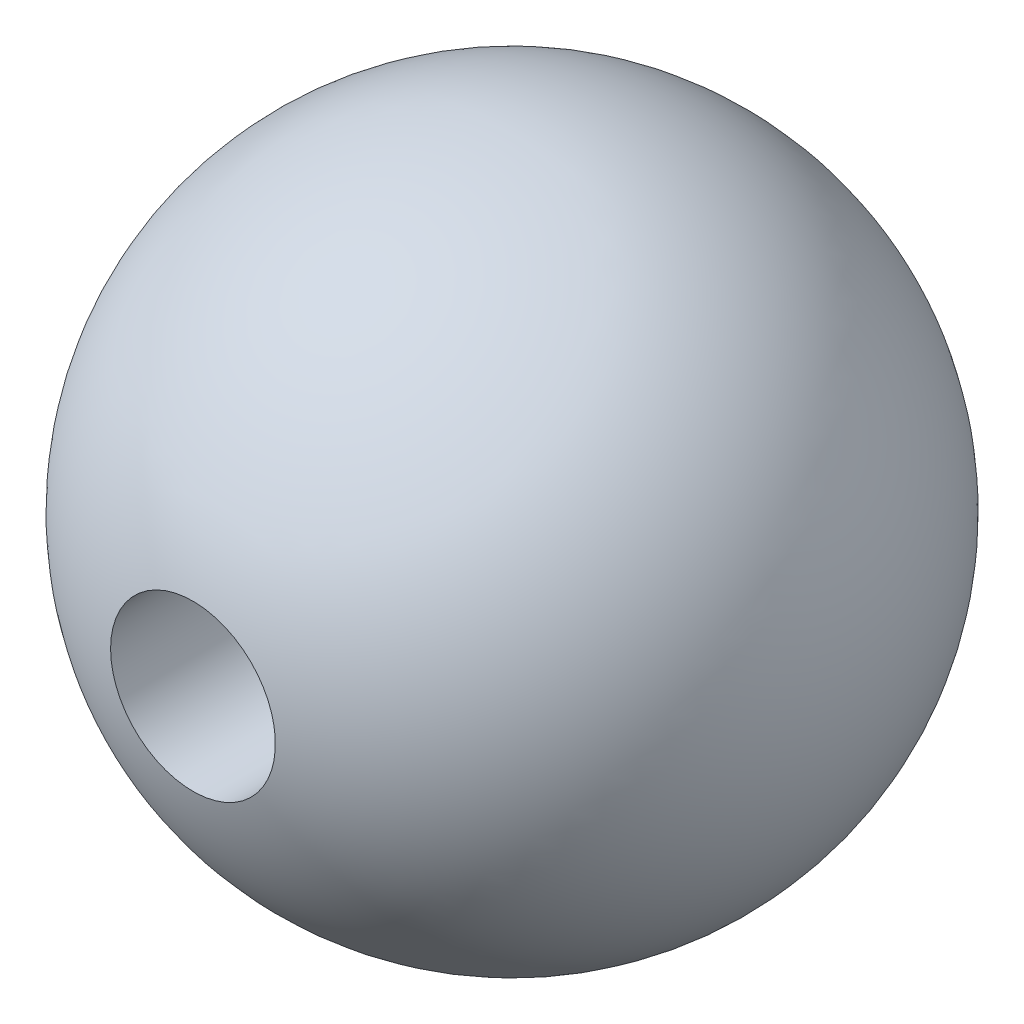
ISO-10303-21;
HEADER;
FILE_DESCRIPTION(('STEP AP214'),'2;1');
FILE_NAME('part.step','',(''),(''),'','','');
FILE_SCHEMA(('AUTOMOTIVE_DESIGN { 1 0 10303 214 1 1 1 1 }'));
ENDSEC;
DATA;
#1=APPLICATION_CONTEXT('core data for automotive mechanical design processes');
#2=APPLICATION_PROTOCOL_DEFINITION('international standard','automotive_design',2000,#1);
#3=PRODUCT_CONTEXT('',#1,'mechanical');
#4=PRODUCT('Part','Part','',(#3));
#5=PRODUCT_RELATED_PRODUCT_CATEGORY('part','',(#4));
#6=PRODUCT_DEFINITION_FORMATION('','',#4);
#7=PRODUCT_DEFINITION_CONTEXT('part definition',#1,'design');
#8=PRODUCT_DEFINITION('design','',#6,#7);
#9=PRODUCT_DEFINITION_SHAPE('','',#8);
#10=(LENGTH_UNIT() NAMED_UNIT(*) SI_UNIT(.MILLI.,.METRE.));
#11=(NAMED_UNIT(*) PLANE_ANGLE_UNIT() SI_UNIT($,.RADIAN.));
#12=(NAMED_UNIT(*) SI_UNIT($,.STERADIAN.) SOLID_ANGLE_UNIT());
#13=UNCERTAINTY_MEASURE_WITH_UNIT(LENGTH_MEASURE(1.E-05),#10,'distance_accuracy_value','');
#14=(GEOMETRIC_REPRESENTATION_CONTEXT(3) GLOBAL_UNCERTAINTY_ASSIGNED_CONTEXT((#13)) GLOBAL_UNIT_ASSIGNED_CONTEXT((#10,
#11,#12)) REPRESENTATION_CONTEXT('',''));
#15=CARTESIAN_POINT('',(0.,0.,0.));
#16=DIRECTION('',(0.,0.,1.));
#17=DIRECTION('',(1.,0.,0.));
#18=AXIS2_PLACEMENT_3D('',#15,#16,#17);
#19=CARTESIAN_POINT('',(0.,0.,0.));
#20=DIRECTION('',(0.,-1.,0.));
#21=DIRECTION('',(-0.999999999999999,0.,0.));
#22=AXIS2_PLACEMENT_3D('',#19,#20,#21);
#23=SPHERICAL_SURFACE('',#22,6.35);
#24=CARTESIAN_POINT('',(0.,0.,0.));
#25=DIRECTION('',(0.,0.,-1.));
#26=DIRECTION('',(-1.,0.,0.));
#27=AXIS2_PLACEMENT_3D('',#24,#25,#26);
#28=SPHERICAL_SURFACE('',#27,6.35);
#29=CARTESIAN_POINT('',(0.,0.,6.14836106210425));
#30=DIRECTION('',(0.,0.,-1.));
#31=DIRECTION('',(-0.999999999999999,0.,0.));
#32=AXIS2_PLACEMENT_3D('',#29,#30,#31);
#33=CIRCLE('',#32,1.5875);
#34=CARTESIAN_POINT('',(-1.5875,0.,6.14836106210425));
#35=VERTEX_POINT('',#34);
#36=EDGE_CURVE('E10',#35,#35,#33,.F.);
#37=ORIENTED_EDGE('',*,*,#36,.F.);
#38=EDGE_LOOP('',(#37));
#39=FACE_BOUND('',#38,.T.);
#40=CARTESIAN_POINT('',(0.,0.,-6.14836106210429));
#41=DIRECTION('',(0.,0.,1.));
#42=DIRECTION('',(0.999999999999999,0.,0.));
#43=AXIS2_PLACEMENT_3D('',#40,#41,#42);
#44=CIRCLE('',#43,1.5875);
#45=CARTESIAN_POINT('',(1.5875,0.,-6.14836106210429));
#46=VERTEX_POINT('',#45);
#47=EDGE_CURVE('E44',#46,#46,#44,.F.);
#48=ORIENTED_EDGE('',*,*,#47,.F.);
#49=EDGE_LOOP('',(#48));
#50=FACE_BOUND('',#49,.T.);
#51=ADVANCED_FACE('F38',(#39,#50),#28,.T.);
#52=CARTESIAN_POINT('',(0.,0.,-12.7));
#53=DIRECTION('',(0.,0.,1.));
#54=DIRECTION('',(0.999999999999999,0.,0.));
#55=AXIS2_PLACEMENT_3D('',#52,#53,#54);
#56=CYLINDRICAL_SURFACE('',#55,1.5875);
#57=ORIENTED_EDGE('',*,*,#36,.T.);
#58=EDGE_LOOP('',(#57));
#59=FACE_BOUND('',#58,.T.);
#60=ORIENTED_EDGE('',*,*,#47,.T.);
#61=EDGE_LOOP('',(#60));
#62=FACE_BOUND('',#61,.T.);
#63=ADVANCED_FACE('F50',(#59,#62),#56,.F.);
#64=CLOSED_SHELL('',(#51,#63));
#65=MANIFOLD_SOLID_BREP('B2',#64);
#66=ADVANCED_BREP_SHAPE_REPRESENTATION('',(#18,#65),#14);
#67=SHAPE_DEFINITION_REPRESENTATION(#9,#66);
ENDSEC;
END-ISO-10303-21;
